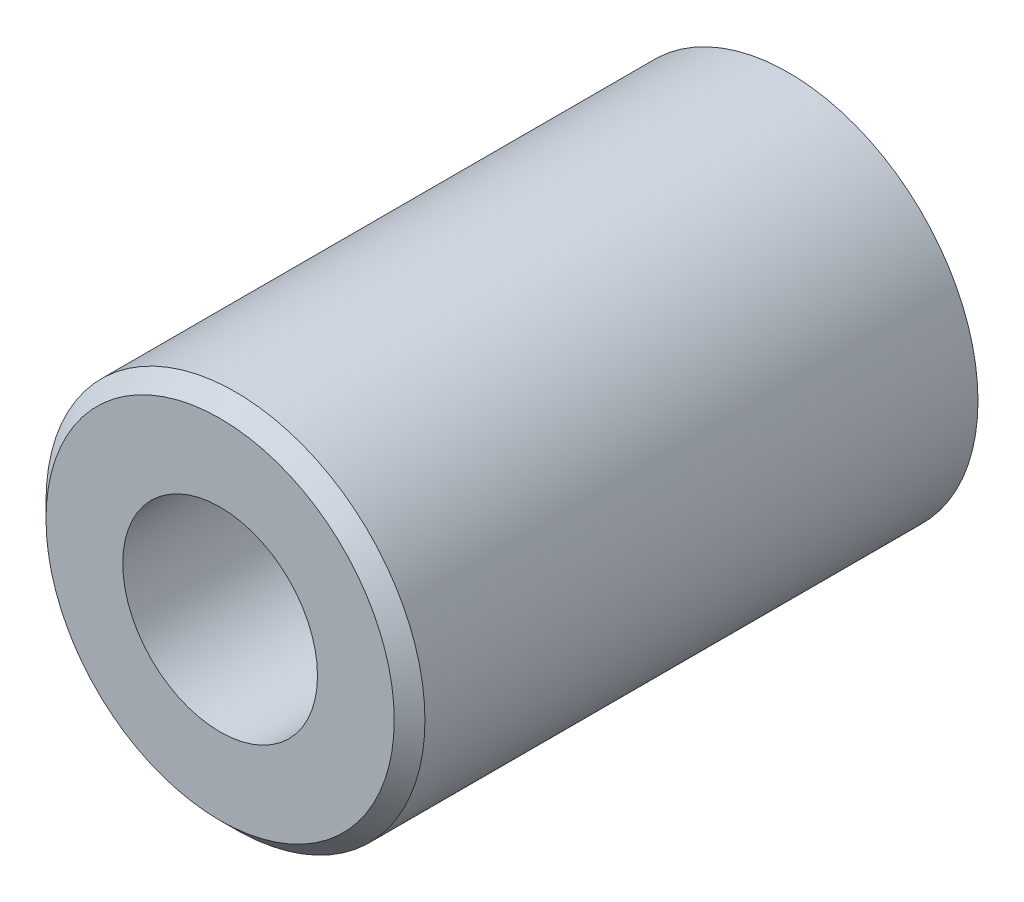
ISO-10303-21;
HEADER;
FILE_DESCRIPTION(('STEP AP214'),'2;1');
FILE_NAME('part.step','',(''),(''),'','','');
FILE_SCHEMA(('AUTOMOTIVE_DESIGN { 1 0 10303 214 1 1 1 1 }'));
ENDSEC;
DATA;
#1=APPLICATION_CONTEXT('core data for automotive mechanical design processes');
#2=APPLICATION_PROTOCOL_DEFINITION('international standard','automotive_design',2000,#1);
#3=PRODUCT_CONTEXT('',#1,'mechanical');
#4=PRODUCT('Part','Part','',(#3));
#5=PRODUCT_RELATED_PRODUCT_CATEGORY('part','',(#4));
#6=PRODUCT_DEFINITION_FORMATION('','',#4);
#7=PRODUCT_DEFINITION_CONTEXT('part definition',#1,'design');
#8=PRODUCT_DEFINITION('design','',#6,#7);
#9=PRODUCT_DEFINITION_SHAPE('','',#8);
#10=(LENGTH_UNIT() NAMED_UNIT(*) SI_UNIT(.MILLI.,.METRE.));
#11=(NAMED_UNIT(*) PLANE_ANGLE_UNIT() SI_UNIT($,.RADIAN.));
#12=(NAMED_UNIT(*) SI_UNIT($,.STERADIAN.) SOLID_ANGLE_UNIT());
#13=UNCERTAINTY_MEASURE_WITH_UNIT(LENGTH_MEASURE(1.E-05),#10,'distance_accuracy_value','');
#14=(GEOMETRIC_REPRESENTATION_CONTEXT(3) GLOBAL_UNCERTAINTY_ASSIGNED_CONTEXT((#13)) GLOBAL_UNIT_ASSIGNED_CONTEXT((#10,
#11,#12)) REPRESENTATION_CONTEXT('',''));
#15=CARTESIAN_POINT('',(0.,0.,0.));
#16=DIRECTION('',(0.,0.,1.));
#17=DIRECTION('',(1.,0.,0.));
#18=AXIS2_PLACEMENT_3D('',#15,#16,#17);
#19=CARTESIAN_POINT('',(0.,0.,9.525));
#20=DIRECTION('',(0.,0.,1.));
#21=DIRECTION('',(1.,0.,0.));
#22=AXIS2_PLACEMENT_3D('',#19,#20,#21);
#23=PLANE('',#22);
#24=CARTESIAN_POINT('',(0.,0.,9.525));
#25=DIRECTION('',(0.,0.,1.));
#26=DIRECTION('',(1.,0.,0.));
#27=AXIS2_PLACEMENT_3D('',#24,#25,#26);
#28=CIRCLE('',#27,5.83565000000001);
#29=CARTESIAN_POINT('',(5.83565000000001,0.,9.525));
#30=VERTEX_POINT('',#29);
#31=EDGE_CURVE('E39',#30,#30,#28,.T.);
#32=ORIENTED_EDGE('',*,*,#31,.T.);
#33=EDGE_LOOP('',(#32));
#34=FACE_BOUND('',#33,.T.);
#35=CARTESIAN_POINT('',(0.,0.,9.525));
#36=DIRECTION('',(0.,0.,1.));
#37=DIRECTION('',(1.,0.,0.));
#38=AXIS2_PLACEMENT_3D('',#35,#36,#37);
#39=CIRCLE('',#38,3.2639);
#40=CARTESIAN_POINT('',(-3.2639,0.,9.525));
#41=VERTEX_POINT('',#40);
#42=EDGE_CURVE('E47',#41,#41,#39,.T.);
#43=ORIENTED_EDGE('',*,*,#42,.F.);
#44=EDGE_LOOP('',(#43));
#45=FACE_BOUND('',#44,.T.);
#46=ADVANCED_FACE('F32',(#34,#45),#23,.T.);
#47=CARTESIAN_POINT('',(0.,0.,-9.525));
#48=DIRECTION('',(0.,0.,1.));
#49=DIRECTION('',(1.,0.,0.));
#50=AXIS2_PLACEMENT_3D('',#47,#48,#49);
#51=PLANE('',#50);
#52=CARTESIAN_POINT('',(0.,0.,-9.525));
#53=DIRECTION('',(0.,0.,1.));
#54=DIRECTION('',(1.,0.,0.));
#55=AXIS2_PLACEMENT_3D('',#52,#53,#54);
#56=CIRCLE('',#55,6.35);
#57=CARTESIAN_POINT('',(-6.35,0.,-9.525));
#58=VERTEX_POINT('',#57);
#59=EDGE_CURVE('E43',#58,#58,#56,.T.);
#60=ORIENTED_EDGE('',*,*,#59,.F.);
#61=EDGE_LOOP('',(#60));
#62=FACE_BOUND('',#61,.T.);
#63=CARTESIAN_POINT('',(0.,0.,-9.525));
#64=DIRECTION('',(0.,0.,1.));
#65=DIRECTION('',(1.,0.,0.));
#66=AXIS2_PLACEMENT_3D('',#63,#64,#65);
#67=CIRCLE('',#66,3.2639);
#68=CARTESIAN_POINT('',(-3.2639,0.,-9.525));
#69=VERTEX_POINT('',#68);
#70=EDGE_CURVE('E50',#69,#69,#67,.T.);
#71=ORIENTED_EDGE('',*,*,#70,.T.);
#72=EDGE_LOOP('',(#71));
#73=FACE_BOUND('',#72,.T.);
#74=ADVANCED_FACE('F60',(#62,#73),#51,.F.);
#75=CARTESIAN_POINT('',(0.,0.,9.525));
#76=DIRECTION('',(0.,0.,-1.));
#77=DIRECTION('',(-1.,0.,0.));
#78=AXIS2_PLACEMENT_3D('',#75,#76,#77);
#79=CYLINDRICAL_SURFACE('',#78,6.35);
#80=CARTESIAN_POINT('',(0.,0.,9.01065000000001));
#81=DIRECTION('',(0.,0.,1.));
#82=DIRECTION('',(1.,0.,0.));
#83=AXIS2_PLACEMENT_3D('',#80,#81,#82);
#84=CIRCLE('',#83,6.35);
#85=CARTESIAN_POINT('',(-6.35,0.,9.01065000000001));
#86=VERTEX_POINT('',#85);
#87=EDGE_CURVE('E10',#86,#86,#84,.F.);
#88=CARTESIAN_POINT('',(-6.35,0.,9.01065000000001));
#89=CARTESIAN_POINT('',(-6.35,0.,8.81757031250001));
#90=CARTESIAN_POINT('',(-6.35,0.,8.62449062500001));
#91=CARTESIAN_POINT('',(-6.35,0.,8.23833125000001));
#92=CARTESIAN_POINT('',(-6.35,0.,8.04525156250001));
#93=CARTESIAN_POINT('',(-6.35,0.,7.65909218750001));
#94=CARTESIAN_POINT('',(-6.35,0.,7.46601250000001));
#95=CARTESIAN_POINT('',(-6.35,0.,7.07985312500001));
#96=CARTESIAN_POINT('',(-6.35,0.,6.88677343750001));
#97=CARTESIAN_POINT('',(-6.35,0.,6.50061406250001));
#98=CARTESIAN_POINT('',(-6.35,0.,6.30753437500001));
#99=CARTESIAN_POINT('',(-6.35,0.,5.92137500000001));
#100=CARTESIAN_POINT('',(-6.35,0.,5.72829531250001));
#101=CARTESIAN_POINT('',(-6.35,0.,5.34213593750001));
#102=CARTESIAN_POINT('',(-6.35,0.,5.14905625000001));
#103=CARTESIAN_POINT('',(-6.35,0.,4.76289687500001));
#104=CARTESIAN_POINT('',(-6.35,0.,4.56981718750001));
#105=CARTESIAN_POINT('',(-6.35,0.,4.18365781250001));
#106=CARTESIAN_POINT('',(-6.35,0.,3.99057812500001));
#107=CARTESIAN_POINT('',(-6.35,0.,3.60441875000001));
#108=CARTESIAN_POINT('',(-6.35,0.,3.41133906250001));
#109=CARTESIAN_POINT('',(-6.35,0.,3.0251796875));
#110=CARTESIAN_POINT('',(-6.35,0.,2.8321));
#111=CARTESIAN_POINT('',(-6.35,0.,2.445940625));
#112=CARTESIAN_POINT('',(-6.35,0.,2.2528609375));
#113=CARTESIAN_POINT('',(-6.35,0.,1.8667015625));
#114=CARTESIAN_POINT('',(-6.35,0.,1.673621875));
#115=CARTESIAN_POINT('',(-6.35,0.,1.2874625));
#116=CARTESIAN_POINT('',(-6.35,0.,1.0943828125));
#117=CARTESIAN_POINT('',(-6.35,0.,0.708223437500004));
#118=CARTESIAN_POINT('',(-6.35,0.,0.515143750000004));
#119=CARTESIAN_POINT('',(-6.35,0.,0.128984375000004));
#120=CARTESIAN_POINT('',(-6.35,0.,-0.0640953124999965));
#121=CARTESIAN_POINT('',(-6.35,0.,-0.450254687499997));
#122=CARTESIAN_POINT('',(-6.35,0.,-0.643334374999997));
#123=CARTESIAN_POINT('',(-6.35,0.,-1.02949375));
#124=CARTESIAN_POINT('',(-6.35,0.,-1.2225734375));
#125=CARTESIAN_POINT('',(-6.35,0.,-1.6087328125));
#126=CARTESIAN_POINT('',(-6.35,0.,-1.8018125));
#127=CARTESIAN_POINT('',(-6.35,0.,-2.187971875));
#128=CARTESIAN_POINT('',(-6.35,0.,-2.3810515625));
#129=CARTESIAN_POINT('',(-6.35,0.,-2.7672109375));
#130=CARTESIAN_POINT('',(-6.35,0.,-2.960290625));
#131=CARTESIAN_POINT('',(-6.35,0.,-3.34645));
#132=CARTESIAN_POINT('',(-6.35,0.,-3.5395296875));
#133=CARTESIAN_POINT('',(-6.35,0.,-3.9256890625));
#134=CARTESIAN_POINT('',(-6.35,0.,-4.11876875));
#135=CARTESIAN_POINT('',(-6.35,0.,-4.504928125));
#136=CARTESIAN_POINT('',(-6.35,0.,-4.6980078125));
#137=CARTESIAN_POINT('',(-6.35,0.,-5.0841671875));
#138=CARTESIAN_POINT('',(-6.35,0.,-5.277246875));
#139=CARTESIAN_POINT('',(-6.35,0.,-5.66340625));
#140=CARTESIAN_POINT('',(-6.35,0.,-5.8564859375));
#141=CARTESIAN_POINT('',(-6.35,0.,-6.2426453125));
#142=CARTESIAN_POINT('',(-6.35,0.,-6.435725));
#143=CARTESIAN_POINT('',(-6.35,0.,-6.821884375));
#144=CARTESIAN_POINT('',(-6.35,0.,-7.0149640625));
#145=CARTESIAN_POINT('',(-6.35,0.,-7.4011234375));
#146=CARTESIAN_POINT('',(-6.35,0.,-7.594203125));
#147=CARTESIAN_POINT('',(-6.35,0.,-7.9803625));
#148=CARTESIAN_POINT('',(-6.35,0.,-8.1734421875));
#149=CARTESIAN_POINT('',(-6.35,0.,-8.5596015625));
#150=CARTESIAN_POINT('',(-6.35,0.,-8.75268125));
#151=CARTESIAN_POINT('',(-6.35,0.,-9.138840625));
#152=CARTESIAN_POINT('',(-6.35,0.,-9.3319203125));
#153=CARTESIAN_POINT('',(-6.35,0.,-9.525));
#154=B_SPLINE_CURVE_WITH_KNOTS('',3,(#88,#89,#90,#91,#92,#93,#94,#95,#96,#97,#98,#99,#100,#101,
#102,#103,#104,#105,#106,#107,#108,#109,#110,#111,#112,#113,#114,#115,#116,#117,#118,#119,#120,
#121,#122,#123,#124,#125,#126,#127,#128,#129,#130,#131,#132,#133,#134,#135,#136,#137,#138,#139,
#140,#141,#142,#143,#144,#145,#146,#147,#148,#149,#150,#151,#152,#153),.UNSPECIFIED.,.F.,.F.,(4,
2,2,2,2,2,2,2,2,2,2,2,2,2,2,2,2,2,2,2,2,2,2,2,2,2,2,2,2,2,2,2,4),(0.,0.579239062499999,
1.158478125,1.7377171875,2.31695625,2.8961953125,3.475434375,4.0546734375,4.6339125,
5.2131515625,5.792390625,6.3716296875,6.95086875,7.5301078125,8.109346875,8.6885859375,9.267825,
9.8470640625,10.426303125,11.0055421875,11.58478125,12.1640203125,12.743259375,13.3224984375,
13.9017375,14.4809765625,15.060215625,15.6394546875,16.21869375,16.7979328125,17.377171875,
17.9564109375,18.53565),.UNSPECIFIED.);
#155=EDGE_CURVE('BSEAM65',#86,#58,#154,.T.);
#156=ORIENTED_EDGE('',*,*,#87,.T.);
#157=ORIENTED_EDGE('',*,*,#59,.T.);
#158=ORIENTED_EDGE('',*,*,#155,.T.);
#159=ORIENTED_EDGE('',*,*,#155,.F.);
#160=EDGE_LOOP('',(#156,#158,#157,#159));
#161=FACE_BOUND('',#160,.T.);
#162=ADVANCED_FACE('F65',(#161),#79,.T.);
#163=CARTESIAN_POINT('',(0.,0.,9.525));
#164=DIRECTION('',(0.,0.,-1.));
#165=DIRECTION('',(-1.,0.,0.));
#166=AXIS2_PLACEMENT_3D('',#163,#164,#165);
#167=CYLINDRICAL_SURFACE('',#166,3.2639);
#168=CARTESIAN_POINT('',(-3.2639,0.,9.525));
#169=CARTESIAN_POINT('',(-3.2639,0.,9.3265625));
#170=CARTESIAN_POINT('',(-3.2639,0.,9.128125));
#171=CARTESIAN_POINT('',(-3.2639,0.,8.73125));
#172=CARTESIAN_POINT('',(-3.2639,0.,8.5328125));
#173=CARTESIAN_POINT('',(-3.2639,0.,8.1359375));
#174=CARTESIAN_POINT('',(-3.2639,0.,7.9375));
#175=CARTESIAN_POINT('',(-3.2639,0.,7.540625));
#176=CARTESIAN_POINT('',(-3.2639,0.,7.3421875));
#177=CARTESIAN_POINT('',(-3.2639,0.,6.9453125));
#178=CARTESIAN_POINT('',(-3.2639,0.,6.746875));
#179=CARTESIAN_POINT('',(-3.2639,0.,6.35));
#180=CARTESIAN_POINT('',(-3.2639,0.,6.1515625));
#181=CARTESIAN_POINT('',(-3.2639,0.,5.7546875));
#182=CARTESIAN_POINT('',(-3.2639,0.,5.55625));
#183=CARTESIAN_POINT('',(-3.2639,0.,5.159375));
#184=CARTESIAN_POINT('',(-3.2639,0.,4.9609375));
#185=CARTESIAN_POINT('',(-3.2639,0.,4.5640625));
#186=CARTESIAN_POINT('',(-3.2639,0.,4.365625));
#187=CARTESIAN_POINT('',(-3.2639,0.,3.96875));
#188=CARTESIAN_POINT('',(-3.2639,0.,3.7703125));
#189=CARTESIAN_POINT('',(-3.2639,0.,3.3734375));
#190=CARTESIAN_POINT('',(-3.2639,0.,3.175));
#191=CARTESIAN_POINT('',(-3.2639,0.,2.778125));
#192=CARTESIAN_POINT('',(-3.2639,0.,2.5796875));
#193=CARTESIAN_POINT('',(-3.2639,0.,2.1828125));
#194=CARTESIAN_POINT('',(-3.2639,0.,1.984375));
#195=CARTESIAN_POINT('',(-3.2639,0.,1.5875));
#196=CARTESIAN_POINT('',(-3.2639,0.,1.3890625));
#197=CARTESIAN_POINT('',(-3.2639,0.,0.992187499999999));
#198=CARTESIAN_POINT('',(-3.2639,0.,0.793749999999999));
#199=CARTESIAN_POINT('',(-3.2639,0.,0.396874999999998));
#200=CARTESIAN_POINT('',(-3.2639,0.,0.198437499999998));
#201=CARTESIAN_POINT('',(-3.2639,0.,-0.198437500000002));
#202=CARTESIAN_POINT('',(-3.2639,0.,-0.396875000000002));
#203=CARTESIAN_POINT('',(-3.2639,0.,-0.793750000000002));
#204=CARTESIAN_POINT('',(-3.2639,0.,-0.992187500000002));
#205=CARTESIAN_POINT('',(-3.2639,0.,-1.3890625));
#206=CARTESIAN_POINT('',(-3.2639,0.,-1.5875));
#207=CARTESIAN_POINT('',(-3.2639,0.,-1.984375));
#208=CARTESIAN_POINT('',(-3.2639,0.,-2.1828125));
#209=CARTESIAN_POINT('',(-3.2639,0.,-2.5796875));
#210=CARTESIAN_POINT('',(-3.2639,0.,-2.778125));
#211=CARTESIAN_POINT('',(-3.2639,0.,-3.175));
#212=CARTESIAN_POINT('',(-3.2639,0.,-3.3734375));
#213=CARTESIAN_POINT('',(-3.2639,0.,-3.7703125));
#214=CARTESIAN_POINT('',(-3.2639,0.,-3.96875));
#215=CARTESIAN_POINT('',(-3.2639,0.,-4.365625));
#216=CARTESIAN_POINT('',(-3.2639,0.,-4.5640625));
#217=CARTESIAN_POINT('',(-3.2639,0.,-4.9609375));
#218=CARTESIAN_POINT('',(-3.2639,0.,-5.159375));
#219=CARTESIAN_POINT('',(-3.2639,0.,-5.55625));
#220=CARTESIAN_POINT('',(-3.2639,0.,-5.7546875));
#221=CARTESIAN_POINT('',(-3.2639,0.,-6.1515625));
#222=CARTESIAN_POINT('',(-3.2639,0.,-6.35));
#223=CARTESIAN_POINT('',(-3.2639,0.,-6.746875));
#224=CARTESIAN_POINT('',(-3.2639,0.,-6.9453125));
#225=CARTESIAN_POINT('',(-3.2639,0.,-7.3421875));
#226=CARTESIAN_POINT('',(-3.2639,0.,-7.540625));
#227=CARTESIAN_POINT('',(-3.2639,0.,-7.9375));
#228=CARTESIAN_POINT('',(-3.2639,0.,-8.1359375));
#229=CARTESIAN_POINT('',(-3.2639,0.,-8.5328125));
#230=CARTESIAN_POINT('',(-3.2639,0.,-8.73125));
#231=CARTESIAN_POINT('',(-3.2639,0.,-9.128125));
#232=CARTESIAN_POINT('',(-3.2639,0.,-9.3265625));
#233=CARTESIAN_POINT('',(-3.2639,0.,-9.525));
#234=B_SPLINE_CURVE_WITH_KNOTS('',3,(#168,#169,#170,#171,#172,#173,#174,#175,#176,#177,#178,
#179,#180,#181,#182,#183,#184,#185,#186,#187,#188,#189,#190,#191,#192,#193,#194,#195,#196,#197,
#198,#199,#200,#201,#202,#203,#204,#205,#206,#207,#208,#209,#210,#211,#212,#213,#214,#215,#216,
#217,#218,#219,#220,#221,#222,#223,#224,#225,#226,#227,#228,#229,#230,#231,#232,#233),
.UNSPECIFIED.,.F.,.F.,(4,2,2,2,2,2,2,2,2,2,2,2,2,2,2,2,2,2,2,2,2,2,2,2,2,2,2,2,2,2,2,2,4),(0.,
0.595312499999999,1.190625,1.7859375,2.38125,2.9765625,3.571875,4.1671875,4.7625,5.3578125,
5.953125,6.5484375,7.14375,7.7390625,8.334375,8.9296875,9.525,10.1203125,10.715625,11.3109375,
11.90625,12.5015625,13.096875,13.6921875,14.2875,14.8828125,15.478125,16.0734375,16.66875,
17.2640625,17.859375,18.4546875,19.05),.UNSPECIFIED.);
#235=EDGE_CURVE('BSEAM56',#41,#69,#234,.T.);
#236=ORIENTED_EDGE('',*,*,#42,.T.);
#237=ORIENTED_EDGE('',*,*,#70,.F.);
#238=ORIENTED_EDGE('',*,*,#235,.T.);
#239=ORIENTED_EDGE('',*,*,#235,.F.);
#240=EDGE_LOOP('',(#236,#238,#237,#239));
#241=FACE_BOUND('',#240,.T.);
#242=ADVANCED_FACE('F56',(#241),#167,.F.);
#243=CARTESIAN_POINT('',(0.,0.,9.525));
#244=DIRECTION('',(0.,0.,-1.));
#245=DIRECTION('',(-1.,0.,0.));
#246=AXIS2_PLACEMENT_3D('',#243,#244,#245);
#247=CONICAL_SURFACE('',#246,5.83565000000001,0.785398163397448);
#248=ORIENTED_EDGE('',*,*,#87,.F.);
#249=EDGE_LOOP('',(#248));
#250=FACE_BOUND('',#249,.T.);
#251=ORIENTED_EDGE('',*,*,#31,.F.);
#252=EDGE_LOOP('',(#251));
#253=FACE_BOUND('',#252,.T.);
#254=ADVANCED_FACE('F34',(#250,#253),#247,.T.);
#255=CLOSED_SHELL('',(#46,#74,#162,#242,#254));
#256=MANIFOLD_SOLID_BREP('B2',#255);
#257=ADVANCED_BREP_SHAPE_REPRESENTATION('',(#18,#256),#14);
#258=SHAPE_DEFINITION_REPRESENTATION(#9,#257);
ENDSEC;
END-ISO-10303-21;
